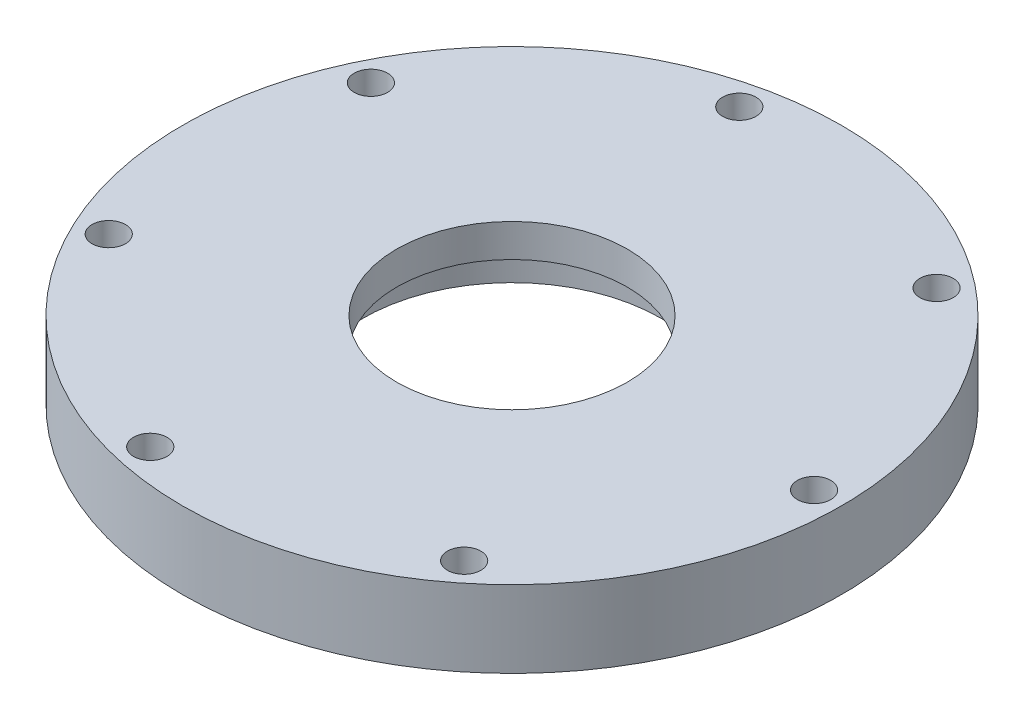
ISO-10303-21;
HEADER;
FILE_DESCRIPTION(('STEP AP214'),'2;1');
FILE_NAME('part.step','',(''),(''),'','','');
FILE_SCHEMA(('AUTOMOTIVE_DESIGN { 1 0 10303 214 1 1 1 1 }'));
ENDSEC;
DATA;
#1=APPLICATION_CONTEXT('core data for automotive mechanical design processes');
#2=APPLICATION_PROTOCOL_DEFINITION('international standard','automotive_design',2000,#1);
#3=PRODUCT_CONTEXT('',#1,'mechanical');
#4=PRODUCT('Part','Part','',(#3));
#5=PRODUCT_RELATED_PRODUCT_CATEGORY('part','',(#4));
#6=PRODUCT_DEFINITION_FORMATION('','',#4);
#7=PRODUCT_DEFINITION_CONTEXT('part definition',#1,'design');
#8=PRODUCT_DEFINITION('design','',#6,#7);
#9=PRODUCT_DEFINITION_SHAPE('','',#8);
#10=(LENGTH_UNIT() NAMED_UNIT(*) SI_UNIT(.MILLI.,.METRE.));
#11=(NAMED_UNIT(*) PLANE_ANGLE_UNIT() SI_UNIT($,.RADIAN.));
#12=(NAMED_UNIT(*) SI_UNIT($,.STERADIAN.) SOLID_ANGLE_UNIT());
#13=UNCERTAINTY_MEASURE_WITH_UNIT(LENGTH_MEASURE(1.E-05),#10,'distance_accuracy_value','');
#14=(GEOMETRIC_REPRESENTATION_CONTEXT(3) GLOBAL_UNCERTAINTY_ASSIGNED_CONTEXT((#13)) GLOBAL_UNIT_ASSIGNED_CONTEXT((#10,
#11,#12)) REPRESENTATION_CONTEXT('',''));
#15=CARTESIAN_POINT('',(0.,0.,0.));
#16=DIRECTION('',(0.,0.,1.));
#17=DIRECTION('',(1.,0.,0.));
#18=AXIS2_PLACEMENT_3D('',#15,#16,#17);
#19=CARTESIAN_POINT('',(0.,7.,0.));
#20=DIRECTION('',(0.,-1.,0.));
#21=DIRECTION('',(0.,0.,-1.));
#22=AXIS2_PLACEMENT_3D('',#19,#20,#21);
#23=CYLINDRICAL_SURFACE('',#22,10.5);
#24=CARTESIAN_POINT('',(0.,7.,0.));
#25=DIRECTION('',(0.,1.,0.));
#26=DIRECTION('',(0.,0.,1.));
#27=AXIS2_PLACEMENT_3D('',#24,#25,#26);
#28=CIRCLE('',#27,10.5);
#29=CARTESIAN_POINT('',(0.,7.,10.5));
#30=VERTEX_POINT('',#29);
#31=EDGE_CURVE('E43',#30,#30,#28,.T.);
#32=ORIENTED_EDGE('',*,*,#31,.T.);
#33=EDGE_LOOP('',(#32));
#34=FACE_BOUND('',#33,.T.);
#35=CARTESIAN_POINT('',(0.,4.,0.));
#36=DIRECTION('',(0.,-1.,0.));
#37=DIRECTION('',(0.,0.,-1.));
#38=AXIS2_PLACEMENT_3D('',#35,#36,#37);
#39=CIRCLE('',#38,10.5);
#40=CARTESIAN_POINT('',(0.,4.,-10.5));
#41=VERTEX_POINT('',#40);
#42=EDGE_CURVE('E34',#41,#41,#39,.T.);
#43=ORIENTED_EDGE('',*,*,#42,.T.);
#44=EDGE_LOOP('',(#43));
#45=FACE_BOUND('',#44,.T.);
#46=ADVANCED_FACE('F30',(#34,#45),#23,.F.);
#47=CARTESIAN_POINT('',(0.,7.,0.));
#48=DIRECTION('',(0.,1.,0.));
#49=DIRECTION('',(0.,0.,1.));
#50=AXIS2_PLACEMENT_3D('',#47,#48,#49);
#51=PLANE('',#50);
#52=CARTESIAN_POINT('',(27.5,7.,0.));
#53=DIRECTION('',(0.,1.,0.));
#54=DIRECTION('',(0.,0.,1.));
#55=AXIS2_PLACEMENT_3D('',#52,#53,#54);
#56=CIRCLE('',#55,1.52);
#57=CARTESIAN_POINT('',(27.5,7.,1.52));
#58=VERTEX_POINT('',#57);
#59=EDGE_CURVE('E90',#58,#58,#56,.T.);
#60=ORIENTED_EDGE('',*,*,#59,.F.);
#61=EDGE_LOOP('',(#60));
#62=FACE_BOUND('',#61,.T.);
#63=CARTESIAN_POINT('',(17.1459695511151,7.,21.5003657678709));
#64=DIRECTION('',(0.,1.,0.));
#65=DIRECTION('',(0.,0.,1.));
#66=AXIS2_PLACEMENT_3D('',#63,#64,#65);
#67=CIRCLE('',#66,1.52);
#68=CARTESIAN_POINT('',(17.1459695511151,7.,23.0203657678709));
#69=VERTEX_POINT('',#68);
#70=EDGE_CURVE('E84',#69,#69,#67,.T.);
#71=ORIENTED_EDGE('',*,*,#70,.F.);
#72=EDGE_LOOP('',(#71));
#73=FACE_BOUND('',#72,.T.);
#74=CARTESIAN_POINT('',(-6.11932568379875,7.,26.8105175850001));
#75=DIRECTION('',(0.,1.,0.));
#76=DIRECTION('',(0.,0.,1.));
#77=AXIS2_PLACEMENT_3D('',#74,#75,#76);
#78=CIRCLE('',#77,1.52);
#79=CARTESIAN_POINT('',(-6.11932568379875,7.,28.3305175850001));
#80=VERTEX_POINT('',#79);
#81=EDGE_CURVE('E78',#80,#80,#78,.T.);
#82=ORIENTED_EDGE('',*,*,#81,.F.);
#83=EDGE_LOOP('',(#82));
#84=FACE_BOUND('',#83,.T.);
#85=CARTESIAN_POINT('',(-24.7766438673166,7.,11.9318028257327));
#86=DIRECTION('',(0.,1.,0.));
#87=DIRECTION('',(0.,0.,1.));
#88=AXIS2_PLACEMENT_3D('',#85,#86,#87);
#89=CIRCLE('',#88,1.52);
#90=CARTESIAN_POINT('',(-24.7766438673166,7.,13.4518028257327));
#91=VERTEX_POINT('',#90);
#92=EDGE_CURVE('E72',#91,#91,#89,.T.);
#93=ORIENTED_EDGE('',*,*,#92,.F.);
#94=EDGE_LOOP('',(#93));
#95=FACE_BOUND('',#94,.T.);
#96=CARTESIAN_POINT('',(-24.7766438673164,7.,-11.931802825733));
#97=DIRECTION('',(0.,1.,0.));
#98=DIRECTION('',(0.,0.,1.));
#99=AXIS2_PLACEMENT_3D('',#96,#97,#98);
#100=CIRCLE('',#99,1.52);
#101=CARTESIAN_POINT('',(-24.7766438673164,7.,-10.411802825733));
#102=VERTEX_POINT('',#101);
#103=EDGE_CURVE('E66',#102,#102,#100,.T.);
#104=ORIENTED_EDGE('',*,*,#103,.F.);
#105=EDGE_LOOP('',(#104));
#106=FACE_BOUND('',#105,.T.);
#107=CARTESIAN_POINT('',(-6.11932568379838,7.,-26.8105175850002));
#108=DIRECTION('',(0.,1.,0.));
#109=DIRECTION('',(0.,0.,1.));
#110=AXIS2_PLACEMENT_3D('',#107,#108,#109);
#111=CIRCLE('',#110,1.52);
#112=CARTESIAN_POINT('',(-6.11932568379838,7.,-25.2905175850002));
#113=VERTEX_POINT('',#112);
#114=EDGE_CURVE('E60',#113,#113,#111,.T.);
#115=ORIENTED_EDGE('',*,*,#114,.F.);
#116=EDGE_LOOP('',(#115));
#117=FACE_BOUND('',#116,.T.);
#118=CARTESIAN_POINT('',(17.1459695511154,7.,-21.5003657678706));
#119=DIRECTION('',(0.,1.,0.));
#120=DIRECTION('',(0.,0.,1.));
#121=AXIS2_PLACEMENT_3D('',#118,#119,#120);
#122=CIRCLE('',#121,1.52);
#123=CARTESIAN_POINT('',(17.1459695511154,7.,-19.9803657678706));
#124=VERTEX_POINT('',#123);
#125=EDGE_CURVE('E54',#124,#124,#122,.T.);
#126=ORIENTED_EDGE('',*,*,#125,.F.);
#127=EDGE_LOOP('',(#126));
#128=FACE_BOUND('',#127,.T.);
#129=CARTESIAN_POINT('',(0.,7.,0.));
#130=DIRECTION('',(0.,1.,0.));
#131=DIRECTION('',(0.,0.,1.));
#132=AXIS2_PLACEMENT_3D('',#129,#130,#131);
#133=CIRCLE('',#132,30.);
#134=CARTESIAN_POINT('',(0.,7.,30.));
#135=VERTEX_POINT('',#134);
#136=EDGE_CURVE('E10',#135,#135,#133,.T.);
#137=ORIENTED_EDGE('',*,*,#136,.T.);
#138=EDGE_LOOP('',(#137));
#139=FACE_BOUND('',#138,.T.);
#140=ORIENTED_EDGE('',*,*,#31,.F.);
#141=EDGE_LOOP('',(#140));
#142=FACE_BOUND('',#141,.T.);
#143=ADVANCED_FACE('F106',(#62,#73,#84,#95,#106,#117,#128,#139,#142),#51,.T.);
#144=CARTESIAN_POINT('',(0.,0.,0.));
#145=DIRECTION('',(0.,1.,0.));
#146=DIRECTION('',(0.,0.,1.));
#147=AXIS2_PLACEMENT_3D('',#144,#145,#146);
#148=PLANE('',#147);
#149=CARTESIAN_POINT('',(27.5,0.,0.));
#150=DIRECTION('',(0.,1.,0.));
#151=DIRECTION('',(0.,0.,1.));
#152=AXIS2_PLACEMENT_3D('',#149,#150,#151);
#153=CIRCLE('',#152,1.52);
#154=CARTESIAN_POINT('',(27.5,0.,1.52));
#155=VERTEX_POINT('',#154);
#156=EDGE_CURVE('E51',#155,#155,#153,.T.);
#157=ORIENTED_EDGE('',*,*,#156,.T.);
#158=EDGE_LOOP('',(#157));
#159=FACE_BOUND('',#158,.T.);
#160=CARTESIAN_POINT('',(17.1459695511151,0.,21.5003657678709));
#161=DIRECTION('',(0.,1.,0.));
#162=DIRECTION('',(0.,0.,1.));
#163=AXIS2_PLACEMENT_3D('',#160,#161,#162);
#164=CIRCLE('',#163,1.52);
#165=CARTESIAN_POINT('',(17.1459695511151,0.,23.0203657678709));
#166=VERTEX_POINT('',#165);
#167=EDGE_CURVE('E87',#166,#166,#164,.T.);
#168=ORIENTED_EDGE('',*,*,#167,.T.);
#169=EDGE_LOOP('',(#168));
#170=FACE_BOUND('',#169,.T.);
#171=CARTESIAN_POINT('',(-6.11932568379875,0.,26.8105175850001));
#172=DIRECTION('',(0.,1.,0.));
#173=DIRECTION('',(0.,0.,1.));
#174=AXIS2_PLACEMENT_3D('',#171,#172,#173);
#175=CIRCLE('',#174,1.52);
#176=CARTESIAN_POINT('',(-6.11932568379875,0.,28.3305175850001));
#177=VERTEX_POINT('',#176);
#178=EDGE_CURVE('E81',#177,#177,#175,.T.);
#179=ORIENTED_EDGE('',*,*,#178,.T.);
#180=EDGE_LOOP('',(#179));
#181=FACE_BOUND('',#180,.T.);
#182=CARTESIAN_POINT('',(-24.7766438673166,0.,11.9318028257327));
#183=DIRECTION('',(0.,1.,0.));
#184=DIRECTION('',(0.,0.,1.));
#185=AXIS2_PLACEMENT_3D('',#182,#183,#184);
#186=CIRCLE('',#185,1.52);
#187=CARTESIAN_POINT('',(-24.7766438673166,0.,13.4518028257327));
#188=VERTEX_POINT('',#187);
#189=EDGE_CURVE('E75',#188,#188,#186,.T.);
#190=ORIENTED_EDGE('',*,*,#189,.T.);
#191=EDGE_LOOP('',(#190));
#192=FACE_BOUND('',#191,.T.);
#193=CARTESIAN_POINT('',(-24.7766438673164,0.,-11.931802825733));
#194=DIRECTION('',(0.,1.,0.));
#195=DIRECTION('',(0.,0.,1.));
#196=AXIS2_PLACEMENT_3D('',#193,#194,#195);
#197=CIRCLE('',#196,1.52);
#198=CARTESIAN_POINT('',(-24.7766438673164,0.,-10.411802825733));
#199=VERTEX_POINT('',#198);
#200=EDGE_CURVE('E69',#199,#199,#197,.T.);
#201=ORIENTED_EDGE('',*,*,#200,.T.);
#202=EDGE_LOOP('',(#201));
#203=FACE_BOUND('',#202,.T.);
#204=CARTESIAN_POINT('',(-6.11932568379838,0.,-26.8105175850002));
#205=DIRECTION('',(0.,1.,0.));
#206=DIRECTION('',(0.,0.,1.));
#207=AXIS2_PLACEMENT_3D('',#204,#205,#206);
#208=CIRCLE('',#207,1.52);
#209=CARTESIAN_POINT('',(-6.11932568379838,0.,-25.2905175850002));
#210=VERTEX_POINT('',#209);
#211=EDGE_CURVE('E63',#210,#210,#208,.T.);
#212=ORIENTED_EDGE('',*,*,#211,.T.);
#213=EDGE_LOOP('',(#212));
#214=FACE_BOUND('',#213,.T.);
#215=CARTESIAN_POINT('',(17.1459695511154,0.,-21.5003657678706));
#216=DIRECTION('',(0.,1.,0.));
#217=DIRECTION('',(0.,0.,1.));
#218=AXIS2_PLACEMENT_3D('',#215,#216,#217);
#219=CIRCLE('',#218,1.52);
#220=CARTESIAN_POINT('',(17.1459695511154,0.,-19.9803657678706));
#221=VERTEX_POINT('',#220);
#222=EDGE_CURVE('E57',#221,#221,#219,.T.);
#223=ORIENTED_EDGE('',*,*,#222,.T.);
#224=EDGE_LOOP('',(#223));
#225=FACE_BOUND('',#224,.T.);
#226=CARTESIAN_POINT('',(0.,0.,0.));
#227=DIRECTION('',(0.,-1.,0.));
#228=DIRECTION('',(0.,0.,-1.));
#229=AXIS2_PLACEMENT_3D('',#226,#227,#228);
#230=CIRCLE('',#229,13.575);
#231=CARTESIAN_POINT('',(0.,0.,-13.575));
#232=VERTEX_POINT('',#231);
#233=EDGE_CURVE('E47',#232,#232,#230,.T.);
#234=ORIENTED_EDGE('',*,*,#233,.F.);
#235=EDGE_LOOP('',(#234));
#236=FACE_BOUND('',#235,.T.);
#237=CARTESIAN_POINT('',(0.,0.,0.));
#238=DIRECTION('',(0.,1.,0.));
#239=DIRECTION('',(0.,0.,1.));
#240=AXIS2_PLACEMENT_3D('',#237,#238,#239);
#241=CIRCLE('',#240,30.);
#242=CARTESIAN_POINT('',(0.,0.,30.));
#243=VERTEX_POINT('',#242);
#244=EDGE_CURVE('E38',#243,#243,#241,.T.);
#245=ORIENTED_EDGE('',*,*,#244,.F.);
#246=EDGE_LOOP('',(#245));
#247=FACE_BOUND('',#246,.T.);
#248=ADVANCED_FACE('F96',(#159,#170,#181,#192,#203,#214,#225,#236,#247),#148,.F.);
#249=CARTESIAN_POINT('',(0.,7.,0.));
#250=DIRECTION('',(0.,-1.,0.));
#251=DIRECTION('',(0.,0.,-1.));
#252=AXIS2_PLACEMENT_3D('',#249,#250,#251);
#253=CYLINDRICAL_SURFACE('',#252,30.);
#254=ORIENTED_EDGE('',*,*,#136,.F.);
#255=EDGE_LOOP('',(#254));
#256=FACE_BOUND('',#255,.T.);
#257=ORIENTED_EDGE('',*,*,#244,.T.);
#258=EDGE_LOOP('',(#257));
#259=FACE_BOUND('',#258,.T.);
#260=ADVANCED_FACE('F32',(#256,#259),#253,.T.);
#261=CARTESIAN_POINT('',(0.,4.,0.));
#262=DIRECTION('',(0.,-1.,0.));
#263=DIRECTION('',(0.,0.,-1.));
#264=AXIS2_PLACEMENT_3D('',#261,#262,#263);
#265=CYLINDRICAL_SURFACE('',#264,13.575);
#266=CARTESIAN_POINT('',(0.,4.,0.));
#267=DIRECTION('',(0.,-1.,0.));
#268=DIRECTION('',(0.,0.,-1.));
#269=AXIS2_PLACEMENT_3D('',#266,#267,#268);
#270=CIRCLE('',#269,13.575);
#271=CARTESIAN_POINT('',(0.,4.,-13.575));
#272=VERTEX_POINT('',#271);
#273=EDGE_CURVE('E50',#272,#272,#270,.T.);
#274=ORIENTED_EDGE('',*,*,#273,.F.);
#275=EDGE_LOOP('',(#274));
#276=FACE_BOUND('',#275,.T.);
#277=ORIENTED_EDGE('',*,*,#233,.T.);
#278=EDGE_LOOP('',(#277));
#279=FACE_BOUND('',#278,.T.);
#280=ADVANCED_FACE('F134',(#276,#279),#265,.F.);
#281=CARTESIAN_POINT('',(0.,4.,0.));
#282=DIRECTION('',(0.,-1.,0.));
#283=DIRECTION('',(0.,0.,-1.));
#284=AXIS2_PLACEMENT_3D('',#281,#282,#283);
#285=PLANE('',#284);
#286=ORIENTED_EDGE('',*,*,#42,.F.);
#287=EDGE_LOOP('',(#286));
#288=FACE_BOUND('',#287,.T.);
#289=ORIENTED_EDGE('',*,*,#273,.T.);
#290=EDGE_LOOP('',(#289));
#291=FACE_BOUND('',#290,.T.);
#292=ADVANCED_FACE('F130',(#288,#291),#285,.T.);
#293=CARTESIAN_POINT('',(17.1459695511154,0.,-21.5003657678706));
#294=DIRECTION('',(0.,1.,0.));
#295=DIRECTION('',(0.,0.,1.));
#296=AXIS2_PLACEMENT_3D('',#293,#294,#295);
#297=CYLINDRICAL_SURFACE('',#296,1.52);
#298=ORIENTED_EDGE('',*,*,#222,.F.);
#299=EDGE_LOOP('',(#298));
#300=FACE_BOUND('',#299,.T.);
#301=ORIENTED_EDGE('',*,*,#125,.T.);
#302=EDGE_LOOP('',(#301));
#303=FACE_BOUND('',#302,.T.);
#304=ADVANCED_FACE('F133',(#300,#303),#297,.F.);
#305=CARTESIAN_POINT('',(-6.11932568379838,0.,-26.8105175850002));
#306=DIRECTION('',(0.,1.,0.));
#307=DIRECTION('',(0.,0.,1.));
#308=AXIS2_PLACEMENT_3D('',#305,#306,#307);
#309=CYLINDRICAL_SURFACE('',#308,1.52);
#310=ORIENTED_EDGE('',*,*,#211,.F.);
#311=EDGE_LOOP('',(#310));
#312=FACE_BOUND('',#311,.T.);
#313=ORIENTED_EDGE('',*,*,#114,.T.);
#314=EDGE_LOOP('',(#313));
#315=FACE_BOUND('',#314,.T.);
#316=ADVANCED_FACE('F169',(#312,#315),#309,.F.);
#317=CARTESIAN_POINT('',(-24.7766438673164,0.,-11.931802825733));
#318=DIRECTION('',(0.,1.,0.));
#319=DIRECTION('',(0.,0.,1.));
#320=AXIS2_PLACEMENT_3D('',#317,#318,#319);
#321=CYLINDRICAL_SURFACE('',#320,1.52);
#322=ORIENTED_EDGE('',*,*,#200,.F.);
#323=EDGE_LOOP('',(#322));
#324=FACE_BOUND('',#323,.T.);
#325=ORIENTED_EDGE('',*,*,#103,.T.);
#326=EDGE_LOOP('',(#325));
#327=FACE_BOUND('',#326,.T.);
#328=ADVANCED_FACE('F177',(#324,#327),#321,.F.);
#329=CARTESIAN_POINT('',(-24.7766438673166,0.,11.9318028257327));
#330=DIRECTION('',(0.,1.,0.));
#331=DIRECTION('',(0.,0.,1.));
#332=AXIS2_PLACEMENT_3D('',#329,#330,#331);
#333=CYLINDRICAL_SURFACE('',#332,1.52);
#334=ORIENTED_EDGE('',*,*,#189,.F.);
#335=EDGE_LOOP('',(#334));
#336=FACE_BOUND('',#335,.T.);
#337=ORIENTED_EDGE('',*,*,#92,.T.);
#338=EDGE_LOOP('',(#337));
#339=FACE_BOUND('',#338,.T.);
#340=ADVANCED_FACE('F185',(#336,#339),#333,.F.);
#341=CARTESIAN_POINT('',(-6.11932568379875,0.,26.8105175850001));
#342=DIRECTION('',(0.,1.,0.));
#343=DIRECTION('',(0.,0.,1.));
#344=AXIS2_PLACEMENT_3D('',#341,#342,#343);
#345=CYLINDRICAL_SURFACE('',#344,1.52);
#346=ORIENTED_EDGE('',*,*,#178,.F.);
#347=EDGE_LOOP('',(#346));
#348=FACE_BOUND('',#347,.T.);
#349=ORIENTED_EDGE('',*,*,#81,.T.);
#350=EDGE_LOOP('',(#349));
#351=FACE_BOUND('',#350,.T.);
#352=ADVANCED_FACE('F193',(#348,#351),#345,.F.);
#353=CARTESIAN_POINT('',(17.1459695511151,0.,21.5003657678709));
#354=DIRECTION('',(0.,1.,0.));
#355=DIRECTION('',(0.,0.,1.));
#356=AXIS2_PLACEMENT_3D('',#353,#354,#355);
#357=CYLINDRICAL_SURFACE('',#356,1.52);
#358=ORIENTED_EDGE('',*,*,#167,.F.);
#359=EDGE_LOOP('',(#358));
#360=FACE_BOUND('',#359,.T.);
#361=ORIENTED_EDGE('',*,*,#70,.T.);
#362=EDGE_LOOP('',(#361));
#363=FACE_BOUND('',#362,.T.);
#364=ADVANCED_FACE('F102',(#360,#363),#357,.F.);
#365=CARTESIAN_POINT('',(27.5,0.,0.));
#366=DIRECTION('',(0.,1.,0.));
#367=DIRECTION('',(0.,0.,1.));
#368=AXIS2_PLACEMENT_3D('',#365,#366,#367);
#369=CYLINDRICAL_SURFACE('',#368,1.52);
#370=ORIENTED_EDGE('',*,*,#156,.F.);
#371=EDGE_LOOP('',(#370));
#372=FACE_BOUND('',#371,.T.);
#373=ORIENTED_EDGE('',*,*,#59,.T.);
#374=EDGE_LOOP('',(#373));
#375=FACE_BOUND('',#374,.T.);
#376=ADVANCED_FACE('F99',(#372,#375),#369,.F.);
#377=CLOSED_SHELL('',(#46,#143,#248,#260,#280,#292,#304,#316,#328,#340,#352,#364,#376));
#378=MANIFOLD_SOLID_BREP('B2',#377);
#379=ADVANCED_BREP_SHAPE_REPRESENTATION('',(#18,#378),#14);
#380=SHAPE_DEFINITION_REPRESENTATION(#9,#379);
ENDSEC;
END-ISO-10303-21;
